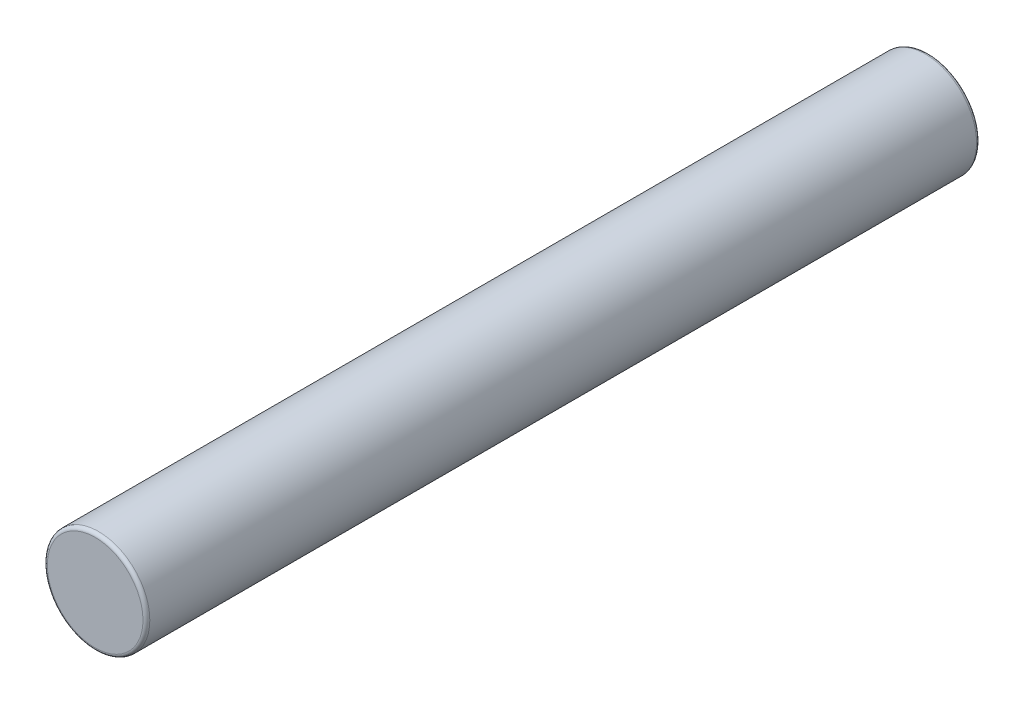
ISO-10303-21;
HEADER;
FILE_DESCRIPTION(('STEP AP214'),'2;1');
FILE_NAME('part.step','',(''),(''),'','','');
FILE_SCHEMA(('AUTOMOTIVE_DESIGN { 1 0 10303 214 1 1 1 1 }'));
ENDSEC;
DATA;
#1=APPLICATION_CONTEXT('core data for automotive mechanical design processes');
#2=APPLICATION_PROTOCOL_DEFINITION('international standard','automotive_design',2000,#1);
#3=PRODUCT_CONTEXT('',#1,'mechanical');
#4=PRODUCT('Part','Part','',(#3));
#5=PRODUCT_RELATED_PRODUCT_CATEGORY('part','',(#4));
#6=PRODUCT_DEFINITION_FORMATION('','',#4);
#7=PRODUCT_DEFINITION_CONTEXT('part definition',#1,'design');
#8=PRODUCT_DEFINITION('design','',#6,#7);
#9=PRODUCT_DEFINITION_SHAPE('','',#8);
#10=(LENGTH_UNIT() NAMED_UNIT(*) SI_UNIT(.MILLI.,.METRE.));
#11=(NAMED_UNIT(*) PLANE_ANGLE_UNIT() SI_UNIT($,.RADIAN.));
#12=(NAMED_UNIT(*) SI_UNIT($,.STERADIAN.) SOLID_ANGLE_UNIT());
#13=UNCERTAINTY_MEASURE_WITH_UNIT(LENGTH_MEASURE(1.E-05),#10,'distance_accuracy_value','');
#14=(GEOMETRIC_REPRESENTATION_CONTEXT(3) GLOBAL_UNCERTAINTY_ASSIGNED_CONTEXT((#13)) GLOBAL_UNIT_ASSIGNED_CONTEXT((#10,
#11,#12)) REPRESENTATION_CONTEXT('',''));
#15=CARTESIAN_POINT('',(0.,0.,0.));
#16=DIRECTION('',(0.,0.,1.));
#17=DIRECTION('',(1.,0.,0.));
#18=AXIS2_PLACEMENT_3D('',#15,#16,#17);
#19=CARTESIAN_POINT('',(0.,0.,12.2));
#20=DIRECTION('',(0.,0.,-1.));
#21=DIRECTION('',(-1.,0.,0.));
#22=AXIS2_PLACEMENT_3D('',#19,#20,#21);
#23=CYLINDRICAL_SURFACE('',#22,0.75);
#24=CARTESIAN_POINT('',(0.,0.,0.0499999999999997));
#25=DIRECTION('',(0.,0.,1.));
#26=DIRECTION('',(1.,0.,0.));
#27=AXIS2_PLACEMENT_3D('',#24,#25,#26);
#28=CIRCLE('',#27,0.75);
#29=CARTESIAN_POINT('',(0.75,0.,0.0499999999999997));
#30=VERTEX_POINT('',#29);
#31=EDGE_CURVE('E39',#30,#30,#28,.T.);
#32=ORIENTED_EDGE('',*,*,#31,.T.);
#33=EDGE_LOOP('',(#32));
#34=FACE_BOUND('',#33,.T.);
#35=CARTESIAN_POINT('',(0.,0.,12.15));
#36=DIRECTION('',(0.,0.,1.));
#37=DIRECTION('',(1.,0.,0.));
#38=AXIS2_PLACEMENT_3D('',#35,#36,#37);
#39=CIRCLE('',#38,0.75);
#40=CARTESIAN_POINT('',(0.75,0.,12.15));
#41=VERTEX_POINT('',#40);
#42=EDGE_CURVE('E43',#41,#41,#39,.F.);
#43=ORIENTED_EDGE('',*,*,#42,.T.);
#44=EDGE_LOOP('',(#43));
#45=FACE_BOUND('',#44,.T.);
#46=ADVANCED_FACE('F28',(#34,#45),#23,.T.);
#47=CARTESIAN_POINT('',(0.,0.,12.2));
#48=DIRECTION('',(0.,0.,1.));
#49=DIRECTION('',(1.,0.,0.));
#50=AXIS2_PLACEMENT_3D('',#47,#48,#49);
#51=PLANE('',#50);
#52=CARTESIAN_POINT('',(0.,0.,12.2));
#53=DIRECTION('',(0.,0.,1.));
#54=DIRECTION('',(1.,0.,0.));
#55=AXIS2_PLACEMENT_3D('',#52,#53,#54);
#56=CIRCLE('',#55,0.7);
#57=CARTESIAN_POINT('',(0.7,0.,12.2));
#58=VERTEX_POINT('',#57);
#59=EDGE_CURVE('E10',#58,#58,#56,.T.);
#60=ORIENTED_EDGE('',*,*,#59,.T.);
#61=EDGE_LOOP('',(#60));
#62=FACE_BOUND('',#61,.T.);
#63=ADVANCED_FACE('F59',(#62),#51,.T.);
#64=CARTESIAN_POINT('',(0.,0.,0.));
#65=DIRECTION('',(0.,0.,1.));
#66=DIRECTION('',(1.,0.,0.));
#67=AXIS2_PLACEMENT_3D('',#64,#65,#66);
#68=PLANE('',#67);
#69=CARTESIAN_POINT('',(0.,0.,0.));
#70=DIRECTION('',(0.,0.,1.));
#71=DIRECTION('',(1.,0.,0.));
#72=AXIS2_PLACEMENT_3D('',#69,#70,#71);
#73=CIRCLE('',#72,0.7);
#74=CARTESIAN_POINT('',(0.7,0.,0.));
#75=VERTEX_POINT('',#74);
#76=EDGE_CURVE('E35',#75,#75,#73,.F.);
#77=ORIENTED_EDGE('',*,*,#76,.T.);
#78=EDGE_LOOP('',(#77));
#79=FACE_BOUND('',#78,.T.);
#80=ADVANCED_FACE('F56',(#79),#68,.F.);
#81=CARTESIAN_POINT('',(0.,0.,0.0499999999999997));
#82=DIRECTION('',(0.,0.,1.));
#83=DIRECTION('',(1.,0.,0.));
#84=AXIS2_PLACEMENT_3D('',#81,#82,#83);
#85=TOROIDAL_SURFACE('',#84,0.7,0.05);
#86=ORIENTED_EDGE('',*,*,#76,.F.);
#87=EDGE_LOOP('',(#86));
#88=FACE_BOUND('',#87,.T.);
#89=ORIENTED_EDGE('',*,*,#31,.F.);
#90=EDGE_LOOP('',(#89));
#91=FACE_BOUND('',#90,.T.);
#92=ADVANCED_FACE('F52',(#88,#91),#85,.T.);
#93=CARTESIAN_POINT('',(0.,0.,12.15));
#94=DIRECTION('',(0.,0.,1.));
#95=DIRECTION('',(1.,0.,0.));
#96=AXIS2_PLACEMENT_3D('',#93,#94,#95);
#97=TOROIDAL_SURFACE('',#96,0.7,0.05);
#98=ORIENTED_EDGE('',*,*,#42,.F.);
#99=EDGE_LOOP('',(#98));
#100=FACE_BOUND('',#99,.T.);
#101=ORIENTED_EDGE('',*,*,#59,.F.);
#102=EDGE_LOOP('',(#101));
#103=FACE_BOUND('',#102,.T.);
#104=ADVANCED_FACE('F30',(#100,#103),#97,.T.);
#105=CLOSED_SHELL('',(#46,#63,#80,#92,#104));
#106=MANIFOLD_SOLID_BREP('B2',#105);
#107=ADVANCED_BREP_SHAPE_REPRESENTATION('',(#18,#106),#14);
#108=SHAPE_DEFINITION_REPRESENTATION(#9,#107);
ENDSEC;
END-ISO-10303-21;
